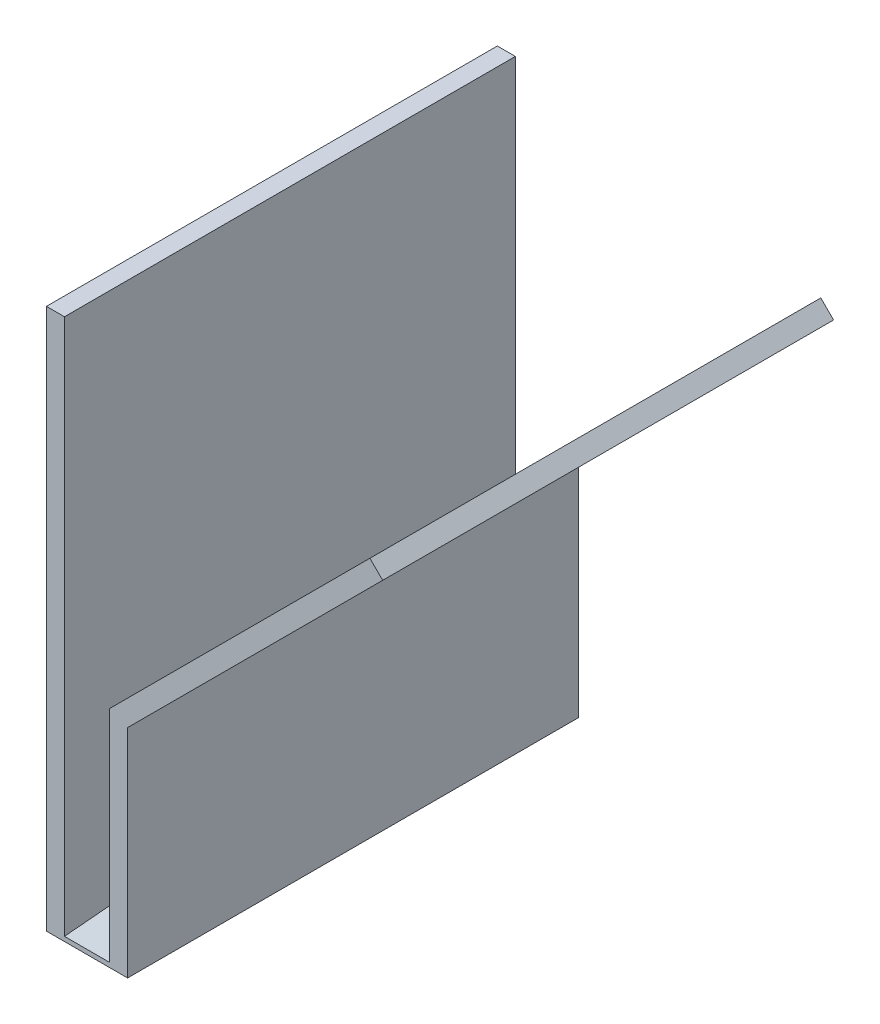
ISO-10303-21;
HEADER;
FILE_DESCRIPTION(('STEP AP214'),'2;1');
FILE_NAME('part.step','',(''),(''),'','','');
FILE_SCHEMA(('AUTOMOTIVE_DESIGN { 1 0 10303 214 1 1 1 1 }'));
ENDSEC;
DATA;
#1=APPLICATION_CONTEXT('core data for automotive mechanical design processes');
#2=APPLICATION_PROTOCOL_DEFINITION('international standard','automotive_design',2000,#1);
#3=PRODUCT_CONTEXT('',#1,'mechanical');
#4=PRODUCT('Part','Part','',(#3));
#5=PRODUCT_RELATED_PRODUCT_CATEGORY('part','',(#4));
#6=PRODUCT_DEFINITION_FORMATION('','',#4);
#7=PRODUCT_DEFINITION_CONTEXT('part definition',#1,'design');
#8=PRODUCT_DEFINITION('design','',#6,#7);
#9=PRODUCT_DEFINITION_SHAPE('','',#8);
#10=(LENGTH_UNIT() NAMED_UNIT(*) SI_UNIT(.MILLI.,.METRE.));
#11=(NAMED_UNIT(*) PLANE_ANGLE_UNIT() SI_UNIT($,.RADIAN.));
#12=(NAMED_UNIT(*) SI_UNIT($,.STERADIAN.) SOLID_ANGLE_UNIT());
#13=UNCERTAINTY_MEASURE_WITH_UNIT(LENGTH_MEASURE(1.E-05),#10,'distance_accuracy_value','');
#14=(GEOMETRIC_REPRESENTATION_CONTEXT(3) GLOBAL_UNCERTAINTY_ASSIGNED_CONTEXT((#13)) GLOBAL_UNIT_ASSIGNED_CONTEXT((#10,
#11,#12)) REPRESENTATION_CONTEXT('',''));
#15=CARTESIAN_POINT('',(0.,0.,0.));
#16=DIRECTION('',(0.,0.,1.));
#17=DIRECTION('',(1.,0.,0.));
#18=AXIS2_PLACEMENT_3D('',#15,#16,#17);
#19=CARTESIAN_POINT('',(4.,0.,100.));
#20=DIRECTION('',(-1.,0.,0.));
#21=DIRECTION('',(0.,0.,1.));
#22=AXIS2_PLACEMENT_3D('',#19,#20,#21);
#23=PLANE('',#22);
#24=DIRECTION('',(0.,-0.0871557427476517,0.996194698091746));
#25=VECTOR('',#24,1.);
#26=CARTESIAN_POINT('',(4.,1.,100.));
#27=LINE('',#26,#25);
#28=CARTESIAN_POINT('',(4.,9.74886635259174,0.));
#29=VERTEX_POINT('',#28);
#30=CARTESIAN_POINT('',(4.,1.,100.));
#31=VERTEX_POINT('',#30);
#32=EDGE_CURVE('E56',#29,#31,#27,.T.);
#33=ORIENTED_EDGE('',*,*,#32,.F.);
#34=DIRECTION('',(0.,1.,0.));
#35=VECTOR('',#34,1.);
#36=CARTESIAN_POINT('',(4.,0.,0.));
#37=LINE('',#36,#35);
#38=CARTESIAN_POINT('',(4.,120.,0.));
#39=VERTEX_POINT('',#38);
#40=EDGE_CURVE('E194',#29,#39,#37,.T.);
#41=ORIENTED_EDGE('',*,*,#40,.T.);
#42=DIRECTION('',(0.,0.,-1.));
#43=VECTOR('',#42,1.);
#44=CARTESIAN_POINT('',(4.,120.,100.));
#45=LINE('',#44,#43);
#46=CARTESIAN_POINT('',(4.,120.,100.));
#47=VERTEX_POINT('',#46);
#48=EDGE_CURVE('E49',#47,#39,#45,.T.);
#49=ORIENTED_EDGE('',*,*,#48,.F.);
#50=DIRECTION('',(0.,1.,0.));
#51=VECTOR('',#50,1.);
#52=CARTESIAN_POINT('',(4.,0.,100.));
#53=LINE('',#52,#51);
#54=EDGE_CURVE('E186',#31,#47,#53,.T.);
#55=ORIENTED_EDGE('',*,*,#54,.F.);
#56=EDGE_LOOP('',(#33,#41,#49,#55));
#57=FACE_BOUND('',#56,.T.);
#58=ADVANCED_FACE('F41',(#57),#23,.F.);
#59=CARTESIAN_POINT('',(0.,0.,100.));
#60=DIRECTION('',(1.,0.,0.));
#61=DIRECTION('',(0.,0.,-1.));
#62=AXIS2_PLACEMENT_3D('',#59,#60,#61);
#63=PLANE('',#62);
#64=DIRECTION('',(0.,-1.,0.));
#65=VECTOR('',#64,1.);
#66=CARTESIAN_POINT('',(0.,0.,0.));
#67=LINE('',#66,#65);
#68=CARTESIAN_POINT('',(0.,120.,0.));
#69=VERTEX_POINT('',#68);
#70=CARTESIAN_POINT('',(0.,0.,0.));
#71=VERTEX_POINT('',#70);
#72=EDGE_CURVE('E182',#69,#71,#67,.T.);
#73=ORIENTED_EDGE('',*,*,#72,.T.);
#74=DIRECTION('',(0.,0.,-1.));
#75=VECTOR('',#74,1.);
#76=CARTESIAN_POINT('',(0.,0.,100.));
#77=LINE('',#76,#75);
#78=CARTESIAN_POINT('',(0.,0.,100.));
#79=VERTEX_POINT('',#78);
#80=EDGE_CURVE('E11',#79,#71,#77,.T.);
#81=ORIENTED_EDGE('',*,*,#80,.F.);
#82=DIRECTION('',(0.,-1.,0.));
#83=VECTOR('',#82,1.);
#84=CARTESIAN_POINT('',(0.,0.,100.));
#85=LINE('',#84,#83);
#86=CARTESIAN_POINT('',(0.,120.,100.));
#87=VERTEX_POINT('',#86);
#88=EDGE_CURVE('E183',#87,#79,#85,.T.);
#89=ORIENTED_EDGE('',*,*,#88,.F.);
#90=DIRECTION('',(0.,0.,-1.));
#91=VECTOR('',#90,1.);
#92=CARTESIAN_POINT('',(0.,120.,100.));
#93=LINE('',#92,#91);
#94=EDGE_CURVE('E189',#87,#69,#93,.T.);
#95=ORIENTED_EDGE('',*,*,#94,.T.);
#96=EDGE_LOOP('',(#73,#81,#89,#95));
#97=FACE_BOUND('',#96,.T.);
#98=ADVANCED_FACE('F43',(#97),#63,.F.);
#99=CARTESIAN_POINT('',(0.,0.,100.));
#100=DIRECTION('',(0.,1.,0.));
#101=DIRECTION('',(0.,0.,1.));
#102=AXIS2_PLACEMENT_3D('',#99,#100,#101);
#103=PLANE('',#102);
#104=DIRECTION('',(1.,0.,0.));
#105=VECTOR('',#104,1.);
#106=CARTESIAN_POINT('',(0.,0.,0.));
#107=LINE('',#106,#105);
#108=CARTESIAN_POINT('',(18.,0.,0.));
#109=VERTEX_POINT('',#108);
#110=EDGE_CURVE('E192',#71,#109,#107,.T.);
#111=ORIENTED_EDGE('',*,*,#110,.T.);
#112=DIRECTION('',(0.,0.,-1.));
#113=VECTOR('',#112,1.);
#114=CARTESIAN_POINT('',(18.,0.,223.379210289891));
#115=LINE('',#114,#113);
#116=CARTESIAN_POINT('',(18.,0.,100.));
#117=VERTEX_POINT('',#116);
#118=EDGE_CURVE('E164',#117,#109,#115,.T.);
#119=ORIENTED_EDGE('',*,*,#118,.F.);
#120=DIRECTION('',(1.,0.,0.));
#121=VECTOR('',#120,1.);
#122=CARTESIAN_POINT('',(0.,0.,100.));
#123=LINE('',#122,#121);
#124=EDGE_CURVE('E87',#79,#117,#123,.T.);
#125=ORIENTED_EDGE('',*,*,#124,.F.);
#126=ORIENTED_EDGE('',*,*,#80,.T.);
#127=EDGE_LOOP('',(#111,#119,#125,#126));
#128=FACE_BOUND('',#127,.T.);
#129=ADVANCED_FACE('F210',(#128),#103,.F.);
#130=CARTESIAN_POINT('',(0.,120.,100.));
#131=DIRECTION('',(0.,-1.,0.));
#132=DIRECTION('',(0.,0.,-1.));
#133=AXIS2_PLACEMENT_3D('',#130,#131,#132);
#134=PLANE('',#133);
#135=DIRECTION('',(-1.,0.,0.));
#136=VECTOR('',#135,1.);
#137=CARTESIAN_POINT('',(0.,120.,0.));
#138=LINE('',#137,#136);
#139=EDGE_CURVE('E81',#39,#69,#138,.T.);
#140=ORIENTED_EDGE('',*,*,#139,.T.);
#141=ORIENTED_EDGE('',*,*,#94,.F.);
#142=DIRECTION('',(-1.,0.,0.));
#143=VECTOR('',#142,1.);
#144=CARTESIAN_POINT('',(0.,120.,100.));
#145=LINE('',#144,#143);
#146=EDGE_CURVE('E65',#47,#87,#145,.T.);
#147=ORIENTED_EDGE('',*,*,#146,.F.);
#148=ORIENTED_EDGE('',*,*,#48,.T.);
#149=EDGE_LOOP('',(#140,#141,#147,#148));
#150=FACE_BOUND('',#149,.T.);
#151=ADVANCED_FACE('F198',(#150),#134,.F.);
#152=CARTESIAN_POINT('',(0.,0.,100.));
#153=DIRECTION('',(0.,0.,-1.));
#154=DIRECTION('',(-1.,0.,0.));
#155=AXIS2_PLACEMENT_3D('',#152,#153,#154);
#156=PLANE('',#155);
#157=ORIENTED_EDGE('',*,*,#88,.T.);
#158=ORIENTED_EDGE('',*,*,#124,.T.);
#159=DIRECTION('',(0.,1.,0.));
#160=VECTOR('',#159,1.);
#161=CARTESIAN_POINT('',(18.,48.0920121030994,100.));
#162=LINE('',#161,#160);
#163=CARTESIAN_POINT('',(18.,48.0920121030994,100.));
#164=VERTEX_POINT('',#163);
#165=EDGE_CURVE('E174',#117,#164,#162,.T.);
#166=ORIENTED_EDGE('',*,*,#165,.T.);
#167=DIRECTION('',(0.707106781186549,0.707106781186546,0.));
#168=VECTOR('',#167,1.);
#169=CARTESIAN_POINT('',(74.5685424949239,104.660554598023,100.));
#170=LINE('',#169,#168);
#171=CARTESIAN_POINT('',(74.5685424949239,104.660554598023,100.));
#172=VERTEX_POINT('',#171);
#173=EDGE_CURVE('E209',#164,#172,#170,.T.);
#174=ORIENTED_EDGE('',*,*,#173,.T.);
#175=DIRECTION('',(-0.707106781186539,0.707106781186556,0.));
#176=VECTOR('',#175,1.);
#177=CARTESIAN_POINT('',(71.7401153701778,107.488981722769,100.));
#178=LINE('',#177,#176);
#179=CARTESIAN_POINT('',(71.7401153701778,107.488981722769,100.));
#180=VERTEX_POINT('',#179);
#181=EDGE_CURVE('E356',#172,#180,#178,.T.);
#182=ORIENTED_EDGE('',*,*,#181,.T.);
#183=DIRECTION('',(-0.707106781186549,-0.707106781186546,0.));
#184=VECTOR('',#183,1.);
#185=CARTESIAN_POINT('',(14.,49.7488663525917,100.));
#186=LINE('',#185,#184);
#187=CARTESIAN_POINT('',(14.,49.7488663525917,100.));
#188=VERTEX_POINT('',#187);
#189=EDGE_CURVE('E167',#180,#188,#186,.T.);
#190=ORIENTED_EDGE('',*,*,#189,.T.);
#191=DIRECTION('',(0.,-1.,0.));
#192=VECTOR('',#191,1.);
#193=CARTESIAN_POINT('',(14.,0.,100.));
#194=LINE('',#193,#192);
#195=CARTESIAN_POINT('',(14.,1.,100.));
#196=VERTEX_POINT('',#195);
#197=EDGE_CURVE('E145',#188,#196,#194,.T.);
#198=ORIENTED_EDGE('',*,*,#197,.T.);
#199=DIRECTION('',(-1.,0.,0.));
#200=VECTOR('',#199,1.);
#201=CARTESIAN_POINT('',(14.,1.,100.));
#202=LINE('',#201,#200);
#203=EDGE_CURVE('E177',#196,#31,#202,.T.);
#204=ORIENTED_EDGE('',*,*,#203,.T.);
#205=ORIENTED_EDGE('',*,*,#54,.T.);
#206=ORIENTED_EDGE('',*,*,#146,.T.);
#207=EDGE_LOOP('',(#157,#158,#166,#174,#182,#190,#198,#204,#205,#206));
#208=FACE_BOUND('',#207,.T.);
#209=ADVANCED_FACE('F202',(#208),#156,.F.);
#210=CARTESIAN_POINT('',(0.,0.,0.));
#211=DIRECTION('',(0.,0.,-1.));
#212=DIRECTION('',(-1.,0.,0.));
#213=AXIS2_PLACEMENT_3D('',#210,#211,#212);
#214=PLANE('',#213);
#215=ORIENTED_EDGE('',*,*,#72,.F.);
#216=ORIENTED_EDGE('',*,*,#139,.F.);
#217=ORIENTED_EDGE('',*,*,#40,.F.);
#218=DIRECTION('',(-1.,0.,0.));
#219=VECTOR('',#218,1.);
#220=CARTESIAN_POINT('',(14.,9.74886635259174,0.));
#221=LINE('',#220,#219);
#222=CARTESIAN_POINT('',(14.,9.74886635259174,0.));
#223=VERTEX_POINT('',#222);
#224=EDGE_CURVE('E135',#223,#29,#221,.T.);
#225=ORIENTED_EDGE('',*,*,#224,.F.);
#226=DIRECTION('',(0.,1.,0.));
#227=VECTOR('',#226,1.);
#228=CARTESIAN_POINT('',(14.,0.,0.));
#229=LINE('',#228,#227);
#230=CARTESIAN_POINT('',(14.,49.7488663525917,0.));
#231=VERTEX_POINT('',#230);
#232=EDGE_CURVE('E127',#223,#231,#229,.T.);
#233=ORIENTED_EDGE('',*,*,#232,.T.);
#234=DIRECTION('',(0.707106781186549,0.707106781186546,0.));
#235=VECTOR('',#234,1.);
#236=CARTESIAN_POINT('',(14.,49.7488663525917,0.));
#237=LINE('',#236,#235);
#238=CARTESIAN_POINT('',(71.7401153701778,107.488981722769,0.));
#239=VERTEX_POINT('',#238);
#240=EDGE_CURVE('E133',#231,#239,#237,.T.);
#241=ORIENTED_EDGE('',*,*,#240,.T.);
#242=DIRECTION('',(0.707106781186539,-0.707106781186556,0.));
#243=VECTOR('',#242,1.);
#244=CARTESIAN_POINT('',(71.7401153701778,107.488981722769,0.));
#245=LINE('',#244,#243);
#246=CARTESIAN_POINT('',(74.5685424949239,104.660554598023,0.));
#247=VERTEX_POINT('',#246);
#248=EDGE_CURVE('E154',#239,#247,#245,.T.);
#249=ORIENTED_EDGE('',*,*,#248,.T.);
#250=DIRECTION('',(-0.707106781186549,-0.707106781186546,0.));
#251=VECTOR('',#250,1.);
#252=CARTESIAN_POINT('',(74.5685424949239,104.660554598023,0.));
#253=LINE('',#252,#251);
#254=CARTESIAN_POINT('',(18.,48.0920121030994,0.));
#255=VERTEX_POINT('',#254);
#256=EDGE_CURVE('E156',#247,#255,#253,.T.);
#257=ORIENTED_EDGE('',*,*,#256,.T.);
#258=DIRECTION('',(0.,-1.,0.));
#259=VECTOR('',#258,1.);
#260=CARTESIAN_POINT('',(18.,48.0920121030994,0.));
#261=LINE('',#260,#259);
#262=EDGE_CURVE('E149',#255,#109,#261,.T.);
#263=ORIENTED_EDGE('',*,*,#262,.T.);
#264=ORIENTED_EDGE('',*,*,#110,.F.);
#265=EDGE_LOOP('',(#215,#216,#217,#225,#233,#241,#249,#257,#263,#264));
#266=FACE_BOUND('',#265,.T.);
#267=ADVANCED_FACE('F130',(#266),#214,.T.);
#268=CARTESIAN_POINT('',(14.,1.,100.));
#269=DIRECTION('',(0.,-0.996194698091746,-0.0871557427476517));
#270=DIRECTION('',(0.,0.0871557427476517,-0.996194698091746));
#271=AXIS2_PLACEMENT_3D('',#268,#269,#270);
#272=PLANE('',#271);
#273=ORIENTED_EDGE('',*,*,#32,.T.);
#274=ORIENTED_EDGE('',*,*,#203,.F.);
#275=DIRECTION('',(0.,-0.0871557427476517,0.996194698091746));
#276=VECTOR('',#275,1.);
#277=CARTESIAN_POINT('',(14.,1.,100.));
#278=LINE('',#277,#276);
#279=EDGE_CURVE('E175',#223,#196,#278,.T.);
#280=ORIENTED_EDGE('',*,*,#279,.F.);
#281=ORIENTED_EDGE('',*,*,#224,.T.);
#282=EDGE_LOOP('',(#273,#274,#280,#281));
#283=FACE_BOUND('',#282,.T.);
#284=ADVANCED_FACE('F224',(#283),#272,.F.);
#285=CARTESIAN_POINT('',(18.,48.0920121030994,223.379210289891));
#286=DIRECTION('',(1.,0.,0.));
#287=DIRECTION('',(0.,1.,0.));
#288=AXIS2_PLACEMENT_3D('',#285,#286,#287);
#289=PLANE('',#288);
#290=ORIENTED_EDGE('',*,*,#165,.F.);
#291=ORIENTED_EDGE('',*,*,#118,.T.);
#292=ORIENTED_EDGE('',*,*,#262,.F.);
#293=DIRECTION('',(0.,0.,-1.));
#294=VECTOR('',#293,1.);
#295=CARTESIAN_POINT('',(18.,48.0920121030994,223.379210289891));
#296=LINE('',#295,#294);
#297=EDGE_CURVE('E168',#164,#255,#296,.T.);
#298=ORIENTED_EDGE('',*,*,#297,.F.);
#299=EDGE_LOOP('',(#290,#291,#292,#298));
#300=FACE_BOUND('',#299,.T.);
#301=ADVANCED_FACE('F207',(#300),#289,.T.);
#302=CARTESIAN_POINT('',(74.5685424949239,104.660554598023,223.379210289891));
#303=DIRECTION('',(0.707106781186546,-0.707106781186549,0.));
#304=DIRECTION('',(0.707106781186549,0.707106781186546,0.));
#305=AXIS2_PLACEMENT_3D('',#302,#303,#304);
#306=PLANE('',#305);
#307=ORIENTED_EDGE('',*,*,#173,.F.);
#308=ORIENTED_EDGE('',*,*,#297,.T.);
#309=ORIENTED_EDGE('',*,*,#256,.F.);
#310=DIRECTION('',(0.,0.,-1.));
#311=VECTOR('',#310,1.);
#312=CARTESIAN_POINT('',(74.5685424949239,104.660554598023,223.379210289891));
#313=LINE('',#312,#311);
#314=EDGE_CURVE('E170',#172,#247,#313,.T.);
#315=ORIENTED_EDGE('',*,*,#314,.F.);
#316=EDGE_LOOP('',(#307,#308,#309,#315));
#317=FACE_BOUND('',#316,.T.);
#318=ADVANCED_FACE('F237',(#317),#306,.T.);
#319=CARTESIAN_POINT('',(71.7401153701778,107.488981722769,223.379210289891));
#320=DIRECTION('',(0.707106781186556,0.707106781186539,0.));
#321=DIRECTION('',(-0.707106781186539,0.707106781186556,0.));
#322=AXIS2_PLACEMENT_3D('',#319,#320,#321);
#323=PLANE('',#322);
#324=ORIENTED_EDGE('',*,*,#181,.F.);
#325=ORIENTED_EDGE('',*,*,#314,.T.);
#326=ORIENTED_EDGE('',*,*,#248,.F.);
#327=DIRECTION('',(0.,0.,-1.));
#328=VECTOR('',#327,1.);
#329=CARTESIAN_POINT('',(71.7401153701778,107.488981722769,223.379210289891));
#330=LINE('',#329,#328);
#331=EDGE_CURVE('E148',#180,#239,#330,.T.);
#332=ORIENTED_EDGE('',*,*,#331,.F.);
#333=EDGE_LOOP('',(#324,#325,#326,#332));
#334=FACE_BOUND('',#333,.T.);
#335=ADVANCED_FACE('F234',(#334),#323,.T.);
#336=CARTESIAN_POINT('',(14.,49.7488663525917,223.379210289891));
#337=DIRECTION('',(-0.707106781186546,0.707106781186549,0.));
#338=DIRECTION('',(-0.707106781186549,-0.707106781186546,0.));
#339=AXIS2_PLACEMENT_3D('',#336,#337,#338);
#340=PLANE('',#339);
#341=ORIENTED_EDGE('',*,*,#189,.F.);
#342=ORIENTED_EDGE('',*,*,#331,.T.);
#343=ORIENTED_EDGE('',*,*,#240,.F.);
#344=DIRECTION('',(0.,0.,-1.));
#345=VECTOR('',#344,1.);
#346=CARTESIAN_POINT('',(14.,49.7488663525917,223.379210289891));
#347=LINE('',#346,#345);
#348=EDGE_CURVE('E142',#188,#231,#347,.T.);
#349=ORIENTED_EDGE('',*,*,#348,.F.);
#350=EDGE_LOOP('',(#341,#342,#343,#349));
#351=FACE_BOUND('',#350,.T.);
#352=ADVANCED_FACE('F151',(#351),#340,.T.);
#353=CARTESIAN_POINT('',(14.,0.,223.379210289891));
#354=DIRECTION('',(-1.,0.,0.));
#355=DIRECTION('',(0.,0.,1.));
#356=AXIS2_PLACEMENT_3D('',#353,#354,#355);
#357=PLANE('',#356);
#358=ORIENTED_EDGE('',*,*,#232,.F.);
#359=ORIENTED_EDGE('',*,*,#279,.T.);
#360=ORIENTED_EDGE('',*,*,#197,.F.);
#361=ORIENTED_EDGE('',*,*,#348,.T.);
#362=EDGE_LOOP('',(#358,#359,#360,#361));
#363=FACE_BOUND('',#362,.T.);
#364=ADVANCED_FACE('F143',(#363),#357,.T.);
#365=CLOSED_SHELL('',(#58,#98,#129,#151,#209,#267,#284,#301,#318,#335,#352,#364));
#366=MANIFOLD_SOLID_BREP('B2',#365);
#367=ADVANCED_BREP_SHAPE_REPRESENTATION('',(#18,#366),#14);
#368=SHAPE_DEFINITION_REPRESENTATION(#9,#367);
ENDSEC;
END-ISO-10303-21;
